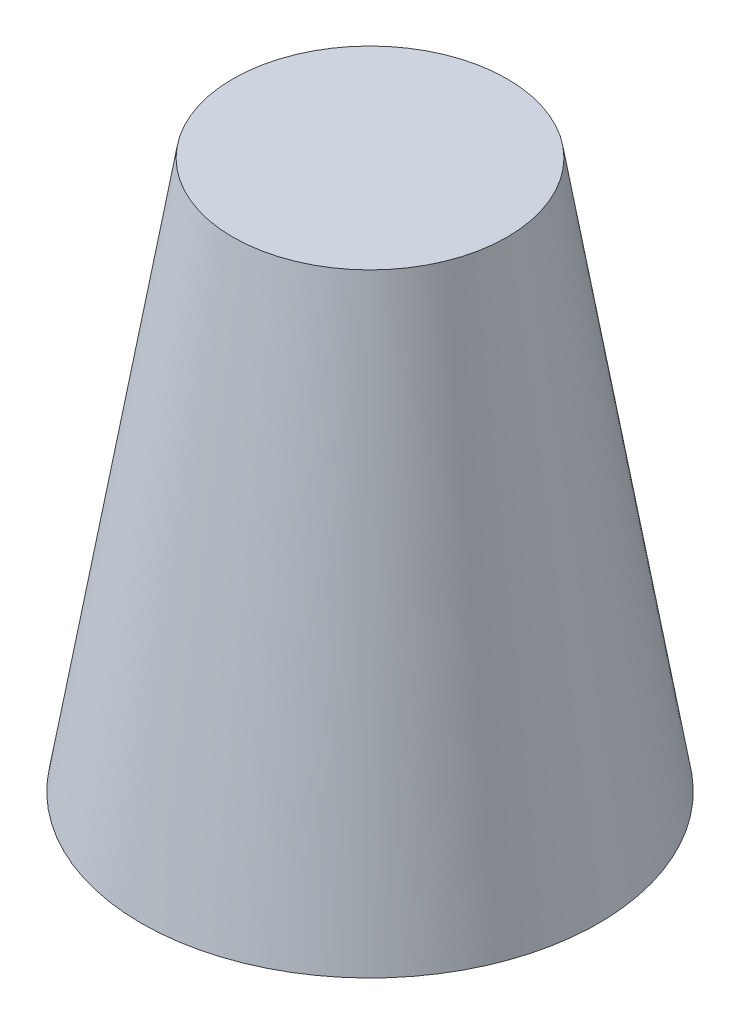
ISO-10303-21;
HEADER;
FILE_DESCRIPTION(('STEP AP214'),'2;1');
FILE_NAME('part.step','',(''),(''),'','','');
FILE_SCHEMA(('AUTOMOTIVE_DESIGN { 1 0 10303 214 1 1 1 1 }'));
ENDSEC;
DATA;
#1=APPLICATION_CONTEXT('core data for automotive mechanical design processes');
#2=APPLICATION_PROTOCOL_DEFINITION('international standard','automotive_design',2000,#1);
#3=PRODUCT_CONTEXT('',#1,'mechanical');
#4=PRODUCT('Part','Part','',(#3));
#5=PRODUCT_RELATED_PRODUCT_CATEGORY('part','',(#4));
#6=PRODUCT_DEFINITION_FORMATION('','',#4);
#7=PRODUCT_DEFINITION_CONTEXT('part definition',#1,'design');
#8=PRODUCT_DEFINITION('design','',#6,#7);
#9=PRODUCT_DEFINITION_SHAPE('','',#8);
#10=(LENGTH_UNIT() NAMED_UNIT(*) SI_UNIT(.MILLI.,.METRE.));
#11=(NAMED_UNIT(*) PLANE_ANGLE_UNIT() SI_UNIT($,.RADIAN.));
#12=(NAMED_UNIT(*) SI_UNIT($,.STERADIAN.) SOLID_ANGLE_UNIT());
#13=UNCERTAINTY_MEASURE_WITH_UNIT(LENGTH_MEASURE(1.E-05),#10,'distance_accuracy_value','');
#14=(GEOMETRIC_REPRESENTATION_CONTEXT(3) GLOBAL_UNCERTAINTY_ASSIGNED_CONTEXT((#13)) GLOBAL_UNIT_ASSIGNED_CONTEXT((#10,
#11,#12)) REPRESENTATION_CONTEXT('',''));
#15=CARTESIAN_POINT('',(0.,0.,0.));
#16=DIRECTION('',(0.,0.,1.));
#17=DIRECTION('',(1.,0.,0.));
#18=AXIS2_PLACEMENT_3D('',#15,#16,#17);
#19=CARTESIAN_POINT('',(0.,0.,0.));
#20=DIRECTION('',(0.,-1.,0.));
#21=DIRECTION('',(0.,0.,-1.));
#22=AXIS2_PLACEMENT_3D('',#19,#20,#21);
#23=PLANE('',#22);
#24=CARTESIAN_POINT('',(0.,0.,0.));
#25=DIRECTION('',(0.,-1.,0.));
#26=DIRECTION('',(0.,0.,-1.));
#27=AXIS2_PLACEMENT_3D('',#24,#25,#26);
#28=CIRCLE('',#27,25.);
#29=CARTESIAN_POINT('',(0.,0.,-25.));
#30=VERTEX_POINT('',#29);
#31=EDGE_CURVE('E10',#30,#30,#28,.T.);
#32=ORIENTED_EDGE('',*,*,#31,.T.);
#33=EDGE_LOOP('',(#32));
#34=FACE_BOUND('',#33,.T.);
#35=ADVANCED_FACE('F37',(#34),#23,.T.);
#36=CARTESIAN_POINT('',(0.,0.,0.));
#37=DIRECTION('',(0.,-1.,0.));
#38=DIRECTION('',(0.,0.,-1.));
#39=AXIS2_PLACEMENT_3D('',#36,#37,#38);
#40=CONICAL_SURFACE('',#39,25.,0.165148677414627);
#41=CARTESIAN_POINT('',(0.,60.,0.));
#42=DIRECTION('',(0.,-1.,0.));
#43=DIRECTION('',(0.,0.,-1.));
#44=AXIS2_PLACEMENT_3D('',#41,#42,#43);
#45=CIRCLE('',#44,15.);
#46=CARTESIAN_POINT('',(0.,60.,-15.));
#47=VERTEX_POINT('',#46);
#48=EDGE_CURVE('E43',#47,#47,#45,.T.);
#49=ORIENTED_EDGE('',*,*,#48,.T.);
#50=EDGE_LOOP('',(#49));
#51=FACE_BOUND('',#50,.T.);
#52=ORIENTED_EDGE('',*,*,#31,.F.);
#53=EDGE_LOOP('',(#52));
#54=FACE_BOUND('',#53,.T.);
#55=ADVANCED_FACE('F49',(#51,#54),#40,.T.);
#56=CARTESIAN_POINT('',(0.,60.,-15.));
#57=DIRECTION('',(0.,1.,0.));
#58=DIRECTION('',(0.,0.,1.));
#59=AXIS2_PLACEMENT_3D('',#56,#57,#58);
#60=PLANE('',#59);
#61=ORIENTED_EDGE('',*,*,#48,.F.);
#62=EDGE_LOOP('',(#61));
#63=FACE_BOUND('',#62,.T.);
#64=ADVANCED_FACE('F52',(#63),#60,.T.);
#65=CLOSED_SHELL('',(#35,#55,#64));
#66=MANIFOLD_SOLID_BREP('B2',#65);
#67=ADVANCED_BREP_SHAPE_REPRESENTATION('',(#18,#66),#14);
#68=SHAPE_DEFINITION_REPRESENTATION(#9,#67);
ENDSEC;
END-ISO-10303-21;
